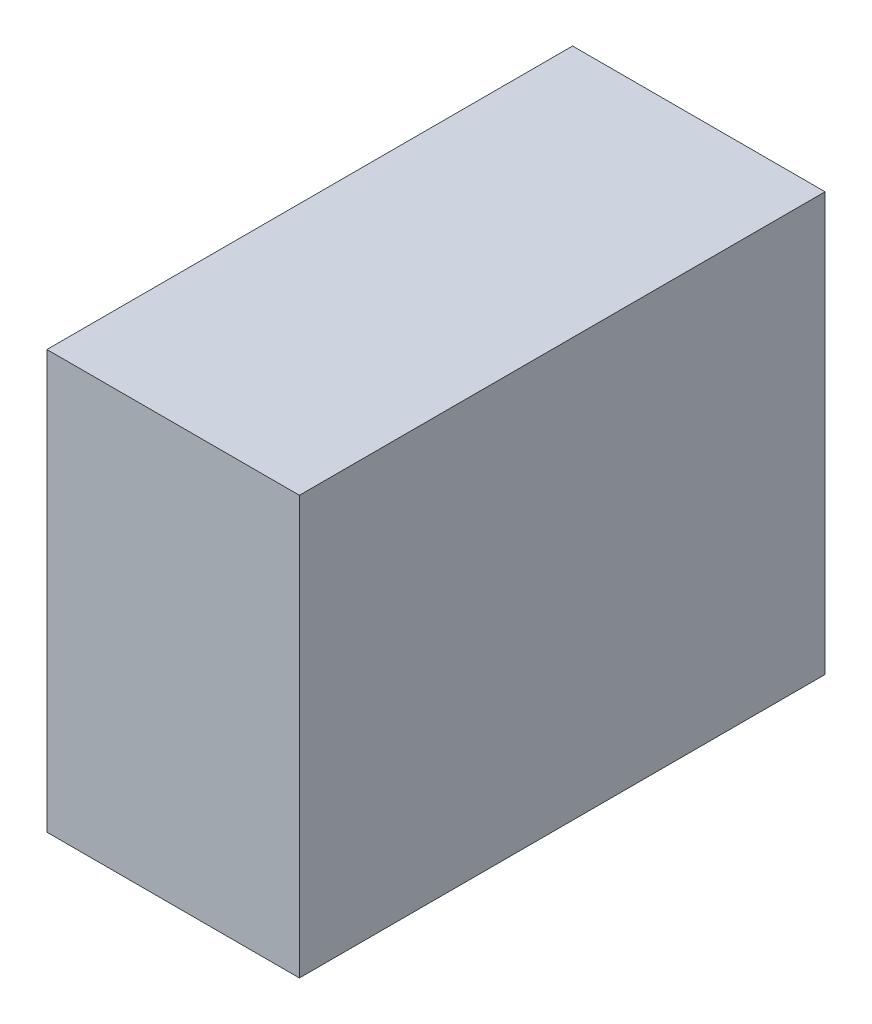
ISO-10303-21;
HEADER;
FILE_DESCRIPTION(('STEP AP214'),'2;1');
FILE_NAME('part.step','',(''),(''),'','','');
FILE_SCHEMA(('AUTOMOTIVE_DESIGN { 1 0 10303 214 1 1 1 1 }'));
ENDSEC;
DATA;
#1=APPLICATION_CONTEXT('core data for automotive mechanical design processes');
#2=APPLICATION_PROTOCOL_DEFINITION('international standard','automotive_design',2000,#1);
#3=PRODUCT_CONTEXT('',#1,'mechanical');
#4=PRODUCT('Part','Part','',(#3));
#5=PRODUCT_RELATED_PRODUCT_CATEGORY('part','',(#4));
#6=PRODUCT_DEFINITION_FORMATION('','',#4);
#7=PRODUCT_DEFINITION_CONTEXT('part definition',#1,'design');
#8=PRODUCT_DEFINITION('design','',#6,#7);
#9=PRODUCT_DEFINITION_SHAPE('','',#8);
#10=(LENGTH_UNIT() NAMED_UNIT(*) SI_UNIT(.MILLI.,.METRE.));
#11=(NAMED_UNIT(*) PLANE_ANGLE_UNIT() SI_UNIT($,.RADIAN.));
#12=(NAMED_UNIT(*) SI_UNIT($,.STERADIAN.) SOLID_ANGLE_UNIT());
#13=UNCERTAINTY_MEASURE_WITH_UNIT(LENGTH_MEASURE(1.E-05),#10,'distance_accuracy_value','');
#14=(GEOMETRIC_REPRESENTATION_CONTEXT(3) GLOBAL_UNCERTAINTY_ASSIGNED_CONTEXT((#13)) GLOBAL_UNIT_ASSIGNED_CONTEXT((#10,
#11,#12)) REPRESENTATION_CONTEXT('',''));
#15=CARTESIAN_POINT('',(0.,0.,0.));
#16=DIRECTION('',(0.,0.,1.));
#17=DIRECTION('',(1.,0.,0.));
#18=AXIS2_PLACEMENT_3D('',#15,#16,#17);
#19=CARTESIAN_POINT('',(-3.05,-2.525,6.35));
#20=DIRECTION('',(0.,1.,0.));
#21=DIRECTION('',(-1.,0.,0.));
#22=AXIS2_PLACEMENT_3D('',#19,#20,#21);
#23=PLANE('',#22);
#24=DIRECTION('',(1.,0.,0.));
#25=VECTOR('',#24,1.);
#26=CARTESIAN_POINT('',(-3.05,-2.525,0.));
#27=LINE('',#26,#25);
#28=CARTESIAN_POINT('',(-3.05,-2.525,0.));
#29=VERTEX_POINT('',#28);
#30=CARTESIAN_POINT('',(0.,-2.525,0.));
#31=VERTEX_POINT('',#30);
#32=EDGE_CURVE('E101',#29,#31,#27,.T.);
#33=ORIENTED_EDGE('',*,*,#32,.T.);
#34=DIRECTION('',(0.,0.,-1.));
#35=VECTOR('',#34,1.);
#36=CARTESIAN_POINT('',(0.,-2.525,6.35));
#37=LINE('',#36,#35);
#38=CARTESIAN_POINT('',(0.,-2.525,6.35));
#39=VERTEX_POINT('',#38);
#40=EDGE_CURVE('E11',#39,#31,#37,.T.);
#41=ORIENTED_EDGE('',*,*,#40,.F.);
#42=DIRECTION('',(1.,0.,0.));
#43=VECTOR('',#42,1.);
#44=CARTESIAN_POINT('',(-3.05,-2.525,6.35));
#45=LINE('',#44,#43);
#46=CARTESIAN_POINT('',(-3.05,-2.525,6.35));
#47=VERTEX_POINT('',#46);
#48=EDGE_CURVE('E95',#47,#39,#45,.T.);
#49=ORIENTED_EDGE('',*,*,#48,.F.);
#50=DIRECTION('',(0.,0.,-1.));
#51=VECTOR('',#50,1.);
#52=CARTESIAN_POINT('',(-3.05,-2.525,6.35));
#53=LINE('',#52,#51);
#54=EDGE_CURVE('E99',#47,#29,#53,.T.);
#55=ORIENTED_EDGE('',*,*,#54,.T.);
#56=EDGE_LOOP('',(#33,#41,#49,#55));
#57=FACE_BOUND('',#56,.T.);
#58=ADVANCED_FACE('F41',(#57),#23,.F.);
#59=CARTESIAN_POINT('',(0.,-2.525,6.35));
#60=DIRECTION('',(-1.,0.,0.));
#61=DIRECTION('',(0.,-1.,0.));
#62=AXIS2_PLACEMENT_3D('',#59,#60,#61);
#63=PLANE('',#62);
#64=DIRECTION('',(0.,1.,0.));
#65=VECTOR('',#64,1.);
#66=CARTESIAN_POINT('',(0.,-2.525,0.));
#67=LINE('',#66,#65);
#68=CARTESIAN_POINT('',(0.,2.525,0.));
#69=VERTEX_POINT('',#68);
#70=EDGE_CURVE('E96',#31,#69,#67,.T.);
#71=ORIENTED_EDGE('',*,*,#70,.T.);
#72=DIRECTION('',(0.,0.,-1.));
#73=VECTOR('',#72,1.);
#74=CARTESIAN_POINT('',(0.,2.525,6.35));
#75=LINE('',#74,#73);
#76=CARTESIAN_POINT('',(0.,2.525,6.35));
#77=VERTEX_POINT('',#76);
#78=EDGE_CURVE('E47',#77,#69,#75,.T.);
#79=ORIENTED_EDGE('',*,*,#78,.F.);
#80=DIRECTION('',(0.,1.,0.));
#81=VECTOR('',#80,1.);
#82=CARTESIAN_POINT('',(0.,-2.525,6.35));
#83=LINE('',#82,#81);
#84=EDGE_CURVE('E90',#39,#77,#83,.T.);
#85=ORIENTED_EDGE('',*,*,#84,.F.);
#86=ORIENTED_EDGE('',*,*,#40,.T.);
#87=EDGE_LOOP('',(#71,#79,#85,#86));
#88=FACE_BOUND('',#87,.T.);
#89=ADVANCED_FACE('F94',(#88),#63,.F.);
#90=CARTESIAN_POINT('',(-3.05,2.525,6.35));
#91=DIRECTION('',(0.,-1.,0.));
#92=DIRECTION('',(1.,0.,0.));
#93=AXIS2_PLACEMENT_3D('',#90,#91,#92);
#94=PLANE('',#93);
#95=DIRECTION('',(-1.,0.,0.));
#96=VECTOR('',#95,1.);
#97=CARTESIAN_POINT('',(-3.05,2.525,0.));
#98=LINE('',#97,#96);
#99=CARTESIAN_POINT('',(-3.05,2.525,0.));
#100=VERTEX_POINT('',#99);
#101=EDGE_CURVE('E73',#69,#100,#98,.T.);
#102=ORIENTED_EDGE('',*,*,#101,.T.);
#103=DIRECTION('',(0.,0.,-1.));
#104=VECTOR('',#103,1.);
#105=CARTESIAN_POINT('',(-3.05,2.525,6.35));
#106=LINE('',#105,#104);
#107=CARTESIAN_POINT('',(-3.05,2.525,6.35));
#108=VERTEX_POINT('',#107);
#109=EDGE_CURVE('E100',#108,#100,#106,.T.);
#110=ORIENTED_EDGE('',*,*,#109,.F.);
#111=DIRECTION('',(-1.,0.,0.));
#112=VECTOR('',#111,1.);
#113=CARTESIAN_POINT('',(-3.05,2.525,6.35));
#114=LINE('',#113,#112);
#115=EDGE_CURVE('E89',#77,#108,#114,.T.);
#116=ORIENTED_EDGE('',*,*,#115,.F.);
#117=ORIENTED_EDGE('',*,*,#78,.T.);
#118=EDGE_LOOP('',(#102,#110,#116,#117));
#119=FACE_BOUND('',#118,.T.);
#120=ADVANCED_FACE('F97',(#119),#94,.F.);
#121=CARTESIAN_POINT('',(-3.05,-2.525,6.35));
#122=DIRECTION('',(1.,0.,0.));
#123=DIRECTION('',(0.,1.,0.));
#124=AXIS2_PLACEMENT_3D('',#121,#122,#123);
#125=PLANE('',#124);
#126=DIRECTION('',(0.,-1.,0.));
#127=VECTOR('',#126,1.);
#128=CARTESIAN_POINT('',(-3.05,-2.525,0.));
#129=LINE('',#128,#127);
#130=EDGE_CURVE('E79',#100,#29,#129,.T.);
#131=ORIENTED_EDGE('',*,*,#130,.T.);
#132=ORIENTED_EDGE('',*,*,#54,.F.);
#133=DIRECTION('',(0.,-1.,0.));
#134=VECTOR('',#133,1.);
#135=CARTESIAN_POINT('',(-3.05,-2.525,6.35));
#136=LINE('',#135,#134);
#137=EDGE_CURVE('E60',#108,#47,#136,.T.);
#138=ORIENTED_EDGE('',*,*,#137,.F.);
#139=ORIENTED_EDGE('',*,*,#109,.T.);
#140=EDGE_LOOP('',(#131,#132,#138,#139));
#141=FACE_BOUND('',#140,.T.);
#142=ADVANCED_FACE('F112',(#141),#125,.F.);
#143=CARTESIAN_POINT('',(0.,0.,6.35));
#144=DIRECTION('',(0.,0.,1.));
#145=DIRECTION('',(1.,0.,0.));
#146=AXIS2_PLACEMENT_3D('',#143,#144,#145);
#147=PLANE('',#146);
#148=ORIENTED_EDGE('',*,*,#48,.T.);
#149=ORIENTED_EDGE('',*,*,#84,.T.);
#150=ORIENTED_EDGE('',*,*,#115,.T.);
#151=ORIENTED_EDGE('',*,*,#137,.T.);
#152=EDGE_LOOP('',(#148,#149,#150,#151));
#153=FACE_BOUND('',#152,.T.);
#154=ADVANCED_FACE('F88',(#153),#147,.T.);
#155=CARTESIAN_POINT('',(0.,0.,0.));
#156=DIRECTION('',(0.,0.,1.));
#157=DIRECTION('',(1.,0.,0.));
#158=AXIS2_PLACEMENT_3D('',#155,#156,#157);
#159=PLANE('',#158);
#160=ORIENTED_EDGE('',*,*,#32,.F.);
#161=ORIENTED_EDGE('',*,*,#130,.F.);
#162=ORIENTED_EDGE('',*,*,#101,.F.);
#163=ORIENTED_EDGE('',*,*,#70,.F.);
#164=EDGE_LOOP('',(#160,#161,#162,#163));
#165=FACE_BOUND('',#164,.T.);
#166=ADVANCED_FACE('F114',(#165),#159,.F.);
#167=CLOSED_SHELL('',(#58,#89,#120,#142,#154,#166));
#168=MANIFOLD_SOLID_BREP('B2',#167);
#169=ADVANCED_BREP_SHAPE_REPRESENTATION('',(#18,#168),#14);
#170=SHAPE_DEFINITION_REPRESENTATION(#9,#169);
ENDSEC;
END-ISO-10303-21;
